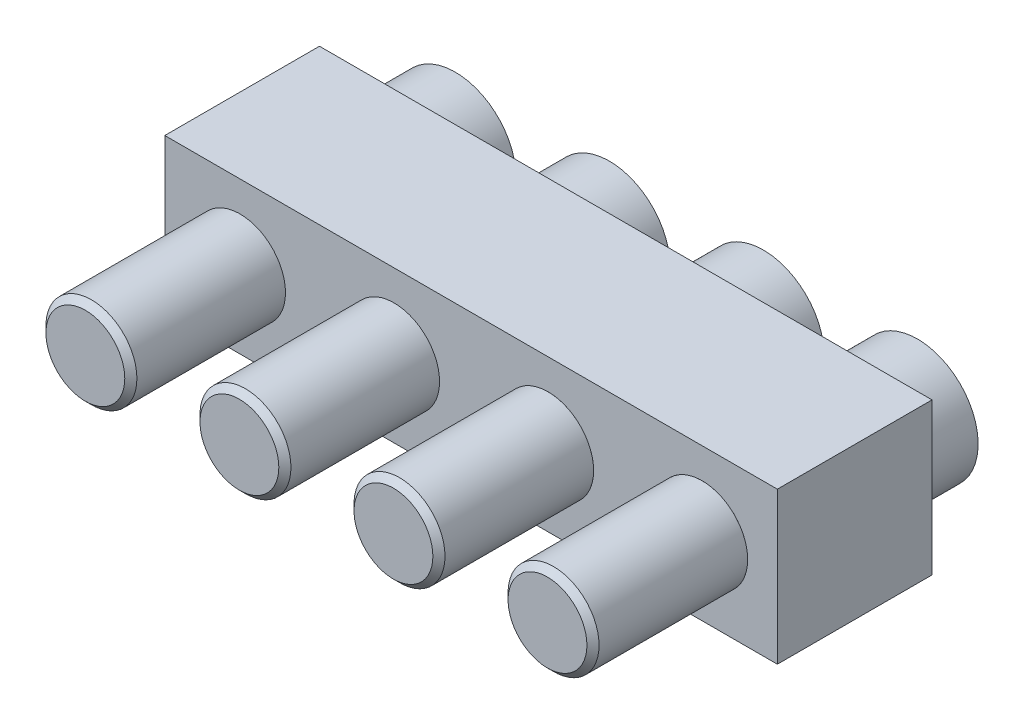
ISO-10303-21;
HEADER;
FILE_DESCRIPTION(('STEP AP214'),'2;1');
FILE_NAME('part.step','',(''),(''),'','','');
FILE_SCHEMA(('AUTOMOTIVE_DESIGN { 1 0 10303 214 1 1 1 1 }'));
ENDSEC;
DATA;
#1=APPLICATION_CONTEXT('core data for automotive mechanical design processes');
#2=APPLICATION_PROTOCOL_DEFINITION('international standard','automotive_design',2000,#1);
#3=PRODUCT_CONTEXT('',#1,'mechanical');
#4=PRODUCT('Part','Part','',(#3));
#5=PRODUCT_RELATED_PRODUCT_CATEGORY('part','',(#4));
#6=PRODUCT_DEFINITION_FORMATION('','',#4);
#7=PRODUCT_DEFINITION_CONTEXT('part definition',#1,'design');
#8=PRODUCT_DEFINITION('design','',#6,#7);
#9=PRODUCT_DEFINITION_SHAPE('','',#8);
#10=(LENGTH_UNIT() NAMED_UNIT(*) SI_UNIT(.MILLI.,.METRE.));
#11=(NAMED_UNIT(*) PLANE_ANGLE_UNIT() SI_UNIT($,.RADIAN.));
#12=(NAMED_UNIT(*) SI_UNIT($,.STERADIAN.) SOLID_ANGLE_UNIT());
#13=UNCERTAINTY_MEASURE_WITH_UNIT(LENGTH_MEASURE(1.E-05),#10,'distance_accuracy_value','');
#14=(GEOMETRIC_REPRESENTATION_CONTEXT(3) GLOBAL_UNCERTAINTY_ASSIGNED_CONTEXT((#13)) GLOBAL_UNIT_ASSIGNED_CONTEXT((#10,
#11,#12)) REPRESENTATION_CONTEXT('',''));
#15=CARTESIAN_POINT('',(0.,0.,0.));
#16=DIRECTION('',(0.,0.,1.));
#17=DIRECTION('',(1.,0.,0.));
#18=AXIS2_PLACEMENT_3D('',#15,#16,#17);
#19=CARTESIAN_POINT('',(8.86,1.24999999999998,5.1));
#20=DIRECTION('',(0.,0.,-1.));
#21=DIRECTION('',(-1.,0.,0.));
#22=AXIS2_PLACEMENT_3D('',#19,#20,#21);
#23=CYLINDRICAL_SURFACE('',#22,0.749999999999998);
#24=CARTESIAN_POINT('',(8.86,1.24999999999998,5.));
#25=DIRECTION('',(0.,0.,1.));
#26=DIRECTION('',(1.,0.,0.));
#27=AXIS2_PLACEMENT_3D('',#24,#25,#26);
#28=CIRCLE('',#27,0.749999999999998);
#29=CARTESIAN_POINT('',(9.61,1.24999999999998,5.));
#30=VERTEX_POINT('',#29);
#31=EDGE_CURVE('E11',#30,#30,#28,.F.);
#32=ORIENTED_EDGE('',*,*,#31,.T.);
#33=EDGE_LOOP('',(#32));
#34=FACE_BOUND('',#33,.T.);
#35=CARTESIAN_POINT('',(8.86,1.24999999999998,2.55));
#36=DIRECTION('',(0.,0.,1.));
#37=DIRECTION('',(1.,0.,0.));
#38=AXIS2_PLACEMENT_3D('',#35,#36,#37);
#39=CIRCLE('',#38,0.749999999999998);
#40=CARTESIAN_POINT('',(9.61,1.24999999999998,2.55));
#41=VERTEX_POINT('',#40);
#42=EDGE_CURVE('E59',#41,#41,#39,.T.);
#43=ORIENTED_EDGE('',*,*,#42,.T.);
#44=EDGE_LOOP('',(#43));
#45=FACE_BOUND('',#44,.T.);
#46=ADVANCED_FACE('F47',(#34,#45),#23,.T.);
#47=CARTESIAN_POINT('',(8.86,1.24999999999998,5.1));
#48=DIRECTION('',(0.,0.,1.));
#49=DIRECTION('',(1.,0.,0.));
#50=AXIS2_PLACEMENT_3D('',#47,#48,#49);
#51=PLANE('',#50);
#52=CARTESIAN_POINT('',(8.86,1.24999999999998,5.1));
#53=DIRECTION('',(0.,0.,1.));
#54=DIRECTION('',(1.,0.,0.));
#55=AXIS2_PLACEMENT_3D('',#52,#53,#54);
#56=CIRCLE('',#55,0.649999999999998);
#57=CARTESIAN_POINT('',(9.51,1.24999999999998,5.1));
#58=VERTEX_POINT('',#57);
#59=EDGE_CURVE('E55',#58,#58,#56,.T.);
#60=ORIENTED_EDGE('',*,*,#59,.T.);
#61=EDGE_LOOP('',(#60));
#62=FACE_BOUND('',#61,.T.);
#63=ADVANCED_FACE('F69',(#62),#51,.T.);
#64=CARTESIAN_POINT('',(8.86,1.24999999999998,2.55));
#65=DIRECTION('',(0.,0.,1.));
#66=DIRECTION('',(1.,0.,0.));
#67=AXIS2_PLACEMENT_3D('',#64,#65,#66);
#68=PLANE('',#67);
#69=ORIENTED_EDGE('',*,*,#42,.F.);
#70=EDGE_LOOP('',(#69));
#71=FACE_BOUND('',#70,.T.);
#72=ADVANCED_FACE('F67',(#71),#68,.F.);
#73=CARTESIAN_POINT('',(8.86,1.24999999999998,5.1));
#74=DIRECTION('',(0.,0.,-1.));
#75=DIRECTION('',(-1.,0.,0.));
#76=AXIS2_PLACEMENT_3D('',#73,#74,#75);
#77=CONICAL_SURFACE('',#76,0.649999999999998,0.78539816339745);
#78=ORIENTED_EDGE('',*,*,#31,.F.);
#79=EDGE_LOOP('',(#78));
#80=FACE_BOUND('',#79,.T.);
#81=ORIENTED_EDGE('',*,*,#59,.F.);
#82=EDGE_LOOP('',(#81));
#83=FACE_BOUND('',#82,.T.);
#84=ADVANCED_FACE('F50',(#80,#83),#77,.T.);
#85=CLOSED_SHELL('',(#46,#63,#72,#84));
#86=MANIFOLD_SOLID_BREP('B2',#85);
#87=CARTESIAN_POINT('',(6.32,1.25,5.1));
#88=DIRECTION('',(0.,0.,-1.));
#89=DIRECTION('',(-1.,0.,0.));
#90=AXIS2_PLACEMENT_3D('',#87,#88,#89);
#91=CYLINDRICAL_SURFACE('',#90,0.75);
#92=CARTESIAN_POINT('',(6.32,1.25,5.));
#93=DIRECTION('',(0.,0.,1.));
#94=DIRECTION('',(1.,0.,0.));
#95=AXIS2_PLACEMENT_3D('',#92,#93,#94);
#96=CIRCLE('',#95,0.75);
#97=CARTESIAN_POINT('',(7.07,1.25,5.));
#98=VERTEX_POINT('',#97);
#99=EDGE_CURVE('E46',#98,#98,#96,.F.);
#100=ORIENTED_EDGE('',*,*,#99,.T.);
#101=EDGE_LOOP('',(#100));
#102=FACE_BOUND('',#101,.T.);
#103=CARTESIAN_POINT('',(6.32,1.25,2.55));
#104=DIRECTION('',(0.,0.,1.));
#105=DIRECTION('',(1.,0.,0.));
#106=AXIS2_PLACEMENT_3D('',#103,#104,#105);
#107=CIRCLE('',#106,0.75);
#108=CARTESIAN_POINT('',(7.07,1.25,2.55));
#109=VERTEX_POINT('',#108);
#110=EDGE_CURVE('E131',#109,#109,#107,.T.);
#111=ORIENTED_EDGE('',*,*,#110,.T.);
#112=EDGE_LOOP('',(#111));
#113=FACE_BOUND('',#112,.T.);
#114=ADVANCED_FACE('F119',(#102,#113),#91,.T.);
#115=CARTESIAN_POINT('',(6.32,1.25,5.1));
#116=DIRECTION('',(0.,0.,1.));
#117=DIRECTION('',(1.,0.,0.));
#118=AXIS2_PLACEMENT_3D('',#115,#116,#117);
#119=PLANE('',#118);
#120=CARTESIAN_POINT('',(6.32,1.25,5.1));
#121=DIRECTION('',(0.,0.,1.));
#122=DIRECTION('',(1.,0.,0.));
#123=AXIS2_PLACEMENT_3D('',#120,#121,#122);
#124=CIRCLE('',#123,0.649999999999999);
#125=CARTESIAN_POINT('',(6.97,1.25,5.1));
#126=VERTEX_POINT('',#125);
#127=EDGE_CURVE('E127',#126,#126,#124,.T.);
#128=ORIENTED_EDGE('',*,*,#127,.T.);
#129=EDGE_LOOP('',(#128));
#130=FACE_BOUND('',#129,.T.);
#131=ADVANCED_FACE('F141',(#130),#119,.T.);
#132=CARTESIAN_POINT('',(6.32,1.25,2.55));
#133=DIRECTION('',(0.,0.,1.));
#134=DIRECTION('',(1.,0.,0.));
#135=AXIS2_PLACEMENT_3D('',#132,#133,#134);
#136=PLANE('',#135);
#137=ORIENTED_EDGE('',*,*,#110,.F.);
#138=EDGE_LOOP('',(#137));
#139=FACE_BOUND('',#138,.T.);
#140=ADVANCED_FACE('F139',(#139),#136,.F.);
#141=CARTESIAN_POINT('',(6.32,1.25,5.1));
#142=DIRECTION('',(0.,0.,-1.));
#143=DIRECTION('',(-1.,0.,0.));
#144=AXIS2_PLACEMENT_3D('',#141,#142,#143);
#145=CONICAL_SURFACE('',#144,0.649999999999999,0.785398163397455);
#146=ORIENTED_EDGE('',*,*,#99,.F.);
#147=EDGE_LOOP('',(#146));
#148=FACE_BOUND('',#147,.T.);
#149=ORIENTED_EDGE('',*,*,#127,.F.);
#150=EDGE_LOOP('',(#149));
#151=FACE_BOUND('',#150,.T.);
#152=ADVANCED_FACE('F122',(#148,#151),#145,.T.);
#153=CLOSED_SHELL('',(#114,#131,#140,#152));
#154=MANIFOLD_SOLID_BREP('B6',#153);
#155=CARTESIAN_POINT('',(1.24,1.24999999999998,5.1));
#156=DIRECTION('',(0.,0.,-1.));
#157=DIRECTION('',(-1.,0.,0.));
#158=AXIS2_PLACEMENT_3D('',#155,#156,#157);
#159=CYLINDRICAL_SURFACE('',#158,0.749999999999999);
#160=CARTESIAN_POINT('',(1.24,1.24999999999998,5.));
#161=DIRECTION('',(0.,0.,1.));
#162=DIRECTION('',(1.,0.,0.));
#163=AXIS2_PLACEMENT_3D('',#160,#161,#162);
#164=CIRCLE('',#163,0.749999999999999);
#165=CARTESIAN_POINT('',(1.99,1.24999999999998,5.));
#166=VERTEX_POINT('',#165);
#167=EDGE_CURVE('E118',#166,#166,#164,.F.);
#168=ORIENTED_EDGE('',*,*,#167,.T.);
#169=EDGE_LOOP('',(#168));
#170=FACE_BOUND('',#169,.T.);
#171=CARTESIAN_POINT('',(1.24,1.24999999999998,2.55));
#172=DIRECTION('',(0.,0.,1.));
#173=DIRECTION('',(1.,0.,0.));
#174=AXIS2_PLACEMENT_3D('',#171,#172,#173);
#175=CIRCLE('',#174,0.749999999999999);
#176=CARTESIAN_POINT('',(1.99,1.24999999999998,2.55));
#177=VERTEX_POINT('',#176);
#178=EDGE_CURVE('E203',#177,#177,#175,.T.);
#179=ORIENTED_EDGE('',*,*,#178,.T.);
#180=EDGE_LOOP('',(#179));
#181=FACE_BOUND('',#180,.T.);
#182=ADVANCED_FACE('F191',(#170,#181),#159,.T.);
#183=CARTESIAN_POINT('',(1.24,1.24999999999998,5.1));
#184=DIRECTION('',(0.,0.,1.));
#185=DIRECTION('',(1.,0.,0.));
#186=AXIS2_PLACEMENT_3D('',#183,#184,#185);
#187=PLANE('',#186);
#188=CARTESIAN_POINT('',(1.24,1.24999999999998,5.1));
#189=DIRECTION('',(0.,0.,1.));
#190=DIRECTION('',(1.,0.,0.));
#191=AXIS2_PLACEMENT_3D('',#188,#189,#190);
#192=CIRCLE('',#191,0.649999999999999);
#193=CARTESIAN_POINT('',(1.89,1.24999999999998,5.1));
#194=VERTEX_POINT('',#193);
#195=EDGE_CURVE('E199',#194,#194,#192,.T.);
#196=ORIENTED_EDGE('',*,*,#195,.T.);
#197=EDGE_LOOP('',(#196));
#198=FACE_BOUND('',#197,.T.);
#199=ADVANCED_FACE('F213',(#198),#187,.T.);
#200=CARTESIAN_POINT('',(1.24,1.24999999999998,2.55));
#201=DIRECTION('',(0.,0.,1.));
#202=DIRECTION('',(1.,0.,0.));
#203=AXIS2_PLACEMENT_3D('',#200,#201,#202);
#204=PLANE('',#203);
#205=ORIENTED_EDGE('',*,*,#178,.F.);
#206=EDGE_LOOP('',(#205));
#207=FACE_BOUND('',#206,.T.);
#208=ADVANCED_FACE('F211',(#207),#204,.F.);
#209=CARTESIAN_POINT('',(1.24,1.24999999999998,5.1));
#210=DIRECTION('',(0.,0.,-1.));
#211=DIRECTION('',(-1.,0.,0.));
#212=AXIS2_PLACEMENT_3D('',#209,#210,#211);
#213=CONICAL_SURFACE('',#212,0.649999999999999,0.785398163397449);
#214=ORIENTED_EDGE('',*,*,#167,.F.);
#215=EDGE_LOOP('',(#214));
#216=FACE_BOUND('',#215,.T.);
#217=ORIENTED_EDGE('',*,*,#195,.F.);
#218=EDGE_LOOP('',(#217));
#219=FACE_BOUND('',#218,.T.);
#220=ADVANCED_FACE('F194',(#216,#219),#213,.T.);
#221=CLOSED_SHELL('',(#182,#199,#208,#220));
#222=MANIFOLD_SOLID_BREP('B41',#221);
#223=CARTESIAN_POINT('',(3.78,1.25,5.1));
#224=DIRECTION('',(0.,0.,-1.));
#225=DIRECTION('',(-1.,0.,0.));
#226=AXIS2_PLACEMENT_3D('',#223,#224,#225);
#227=CYLINDRICAL_SURFACE('',#226,0.749999999999999);
#228=CARTESIAN_POINT('',(3.78,1.25,5.));
#229=DIRECTION('',(0.,0.,1.));
#230=DIRECTION('',(1.,0.,0.));
#231=AXIS2_PLACEMENT_3D('',#228,#229,#230);
#232=CIRCLE('',#231,0.749999999999999);
#233=CARTESIAN_POINT('',(4.53,1.25,5.));
#234=VERTEX_POINT('',#233);
#235=EDGE_CURVE('E190',#234,#234,#232,.F.);
#236=ORIENTED_EDGE('',*,*,#235,.T.);
#237=EDGE_LOOP('',(#236));
#238=FACE_BOUND('',#237,.T.);
#239=CARTESIAN_POINT('',(3.78,1.25,2.55));
#240=DIRECTION('',(0.,0.,1.));
#241=DIRECTION('',(1.,0.,0.));
#242=AXIS2_PLACEMENT_3D('',#239,#240,#241);
#243=CIRCLE('',#242,0.749999999999999);
#244=CARTESIAN_POINT('',(4.53,1.25,2.55));
#245=VERTEX_POINT('',#244);
#246=EDGE_CURVE('E276',#245,#245,#243,.T.);
#247=ORIENTED_EDGE('',*,*,#246,.T.);
#248=EDGE_LOOP('',(#247));
#249=FACE_BOUND('',#248,.T.);
#250=ADVANCED_FACE('F264',(#238,#249),#227,.T.);
#251=CARTESIAN_POINT('',(3.78,1.25,5.1));
#252=DIRECTION('',(0.,0.,1.));
#253=DIRECTION('',(1.,0.,0.));
#254=AXIS2_PLACEMENT_3D('',#251,#252,#253);
#255=PLANE('',#254);
#256=CARTESIAN_POINT('',(3.78,1.25,5.1));
#257=DIRECTION('',(0.,0.,1.));
#258=DIRECTION('',(1.,0.,0.));
#259=AXIS2_PLACEMENT_3D('',#256,#257,#258);
#260=CIRCLE('',#259,0.65);
#261=CARTESIAN_POINT('',(4.43,1.25,5.1));
#262=VERTEX_POINT('',#261);
#263=EDGE_CURVE('E272',#262,#262,#260,.T.);
#264=ORIENTED_EDGE('',*,*,#263,.T.);
#265=EDGE_LOOP('',(#264));
#266=FACE_BOUND('',#265,.T.);
#267=ADVANCED_FACE('F286',(#266),#255,.T.);
#268=CARTESIAN_POINT('',(3.78,1.25,2.55));
#269=DIRECTION('',(0.,0.,1.));
#270=DIRECTION('',(1.,0.,0.));
#271=AXIS2_PLACEMENT_3D('',#268,#269,#270);
#272=PLANE('',#271);
#273=ORIENTED_EDGE('',*,*,#246,.F.);
#274=EDGE_LOOP('',(#273));
#275=FACE_BOUND('',#274,.T.);
#276=ADVANCED_FACE('F284',(#275),#272,.F.);
#277=CARTESIAN_POINT('',(3.78,1.25,5.1));
#278=DIRECTION('',(0.,0.,-1.));
#279=DIRECTION('',(-1.,0.,0.));
#280=AXIS2_PLACEMENT_3D('',#277,#278,#279);
#281=CONICAL_SURFACE('',#280,0.649999999999999,0.785398163397444);
#282=ORIENTED_EDGE('',*,*,#235,.F.);
#283=EDGE_LOOP('',(#282));
#284=FACE_BOUND('',#283,.T.);
#285=ORIENTED_EDGE('',*,*,#263,.F.);
#286=EDGE_LOOP('',(#285));
#287=FACE_BOUND('',#286,.T.);
#288=ADVANCED_FACE('F267',(#284,#287),#281,.T.);
#289=CLOSED_SHELL('',(#250,#267,#276,#288));
#290=MANIFOLD_SOLID_BREP('B113',#289);
#291=CARTESIAN_POINT('',(0.,0.,2.55));
#292=DIRECTION('',(0.,0.,-1.));
#293=DIRECTION('',(-1.,0.,0.));
#294=AXIS2_PLACEMENT_3D('',#291,#292,#293);
#295=PLANE('',#294);
#296=DIRECTION('',(0.,-1.,0.));
#297=VECTOR('',#296,1.);
#298=CARTESIAN_POINT('',(0.,0.,2.55));
#299=LINE('',#298,#297);
#300=CARTESIAN_POINT('',(0.,2.5,2.55));
#301=VERTEX_POINT('',#300);
#302=CARTESIAN_POINT('',(0.,0.,2.55));
#303=VERTEX_POINT('',#302);
#304=EDGE_CURVE('E380',#301,#303,#299,.T.);
#305=ORIENTED_EDGE('',*,*,#304,.T.);
#306=DIRECTION('',(1.,0.,0.));
#307=VECTOR('',#306,1.);
#308=CARTESIAN_POINT('',(0.,0.,2.55));
#309=LINE('',#308,#307);
#310=CARTESIAN_POINT('',(10.1,0.,2.55));
#311=VERTEX_POINT('',#310);
#312=EDGE_CURVE('E375',#303,#311,#309,.T.);
#313=ORIENTED_EDGE('',*,*,#312,.T.);
#314=DIRECTION('',(0.,1.,0.));
#315=VECTOR('',#314,1.);
#316=CARTESIAN_POINT('',(10.1,0.,2.55));
#317=LINE('',#316,#315);
#318=CARTESIAN_POINT('',(10.1,2.5,2.55));
#319=VERTEX_POINT('',#318);
#320=EDGE_CURVE('E378',#311,#319,#317,.T.);
#321=ORIENTED_EDGE('',*,*,#320,.T.);
#322=DIRECTION('',(-1.,0.,0.));
#323=VECTOR('',#322,1.);
#324=CARTESIAN_POINT('',(0.,2.5,2.55));
#325=LINE('',#324,#323);
#326=EDGE_CURVE('E345',#319,#301,#325,.T.);
#327=ORIENTED_EDGE('',*,*,#326,.T.);
#328=EDGE_LOOP('',(#305,#313,#321,#327));
#329=FACE_BOUND('',#328,.T.);
#330=CARTESIAN_POINT('',(3.78,1.25,2.55));
#331=DIRECTION('',(0.,0.,1.));
#332=DIRECTION('',(1.,0.,0.));
#333=AXIS2_PLACEMENT_3D('',#330,#331,#332);
#334=CIRCLE('',#333,0.749999999999999);
#335=CARTESIAN_POINT('',(4.53,1.25,2.55));
#336=VERTEX_POINT('',#335);
#337=EDGE_CURVE('E395',#336,#336,#334,.T.);
#338=ORIENTED_EDGE('',*,*,#337,.F.);
#339=EDGE_LOOP('',(#338));
#340=FACE_BOUND('',#339,.T.);
#341=CARTESIAN_POINT('',(8.86,1.24999999999998,2.55));
#342=DIRECTION('',(0.,0.,1.));
#343=DIRECTION('',(-1.,0.,0.));
#344=AXIS2_PLACEMENT_3D('',#341,#342,#343);
#345=CIRCLE('',#344,0.749999999999998);
#346=CARTESIAN_POINT('',(8.11,1.24999999999998,2.55));
#347=VERTEX_POINT('',#346);
#348=EDGE_CURVE('E409',#347,#347,#345,.T.);
#349=ORIENTED_EDGE('',*,*,#348,.F.);
#350=EDGE_LOOP('',(#349));
#351=FACE_BOUND('',#350,.T.);
#352=CARTESIAN_POINT('',(1.24,1.24999999999998,2.55));
#353=DIRECTION('',(0.,0.,1.));
#354=DIRECTION('',(1.,0.,0.));
#355=AXIS2_PLACEMENT_3D('',#352,#353,#354);
#356=CIRCLE('',#355,0.749999999999999);
#357=CARTESIAN_POINT('',(1.99,1.24999999999998,2.55));
#358=VERTEX_POINT('',#357);
#359=EDGE_CURVE('E415',#358,#358,#356,.T.);
#360=ORIENTED_EDGE('',*,*,#359,.F.);
#361=EDGE_LOOP('',(#360));
#362=FACE_BOUND('',#361,.T.);
#363=CARTESIAN_POINT('',(6.32,1.25,2.55));
#364=DIRECTION('',(0.,0.,1.));
#365=DIRECTION('',(-1.,0.,0.));
#366=AXIS2_PLACEMENT_3D('',#363,#364,#365);
#367=CIRCLE('',#366,0.749999999999999);
#368=CARTESIAN_POINT('',(5.57,1.25,2.55));
#369=VERTEX_POINT('',#368);
#370=EDGE_CURVE('E421',#369,#369,#367,.T.);
#371=ORIENTED_EDGE('',*,*,#370,.F.);
#372=EDGE_LOOP('',(#371));
#373=FACE_BOUND('',#372,.T.);
#374=ADVANCED_FACE('F328',(#329,#340,#351,#362,#373),#295,.F.);
#375=CARTESIAN_POINT('',(0.,0.,0.));
#376=DIRECTION('',(0.,0.,-1.));
#377=DIRECTION('',(-1.,0.,0.));
#378=AXIS2_PLACEMENT_3D('',#375,#376,#377);
#379=PLANE('',#378);
#380=CARTESIAN_POINT('',(1.24,1.24999999999998,0.));
#381=DIRECTION('',(0.,0.,-1.));
#382=DIRECTION('',(1.,0.,0.));
#383=AXIS2_PLACEMENT_3D('',#380,#381,#382);
#384=CIRCLE('',#383,1.);
#385=CARTESIAN_POINT('',(2.24,1.24999999999998,0.));
#386=VERTEX_POINT('',#385);
#387=EDGE_CURVE('E448',#386,#386,#384,.T.);
#388=ORIENTED_EDGE('',*,*,#387,.F.);
#389=EDGE_LOOP('',(#388));
#390=FACE_BOUND('',#389,.T.);
#391=CARTESIAN_POINT('',(3.78,1.25,0.));
#392=DIRECTION('',(0.,0.,-1.));
#393=DIRECTION('',(1.,0.,0.));
#394=AXIS2_PLACEMENT_3D('',#391,#392,#393);
#395=CIRCLE('',#394,1.);
#396=CARTESIAN_POINT('',(4.78,1.25,0.));
#397=VERTEX_POINT('',#396);
#398=EDGE_CURVE('E442',#397,#397,#395,.T.);
#399=ORIENTED_EDGE('',*,*,#398,.F.);
#400=EDGE_LOOP('',(#399));
#401=FACE_BOUND('',#400,.T.);
#402=CARTESIAN_POINT('',(8.86,1.24999999999998,0.));
#403=DIRECTION('',(0.,0.,-1.));
#404=DIRECTION('',(-1.,0.,0.));
#405=AXIS2_PLACEMENT_3D('',#402,#403,#404);
#406=CIRCLE('',#405,1.);
#407=CARTESIAN_POINT('',(7.86,1.24999999999998,0.));
#408=VERTEX_POINT('',#407);
#409=EDGE_CURVE('E436',#408,#408,#406,.T.);
#410=ORIENTED_EDGE('',*,*,#409,.F.);
#411=EDGE_LOOP('',(#410));
#412=FACE_BOUND('',#411,.T.);
#413=CARTESIAN_POINT('',(6.32,1.25,0.));
#414=DIRECTION('',(0.,0.,-1.));
#415=DIRECTION('',(-1.,0.,0.));
#416=AXIS2_PLACEMENT_3D('',#413,#414,#415);
#417=CIRCLE('',#416,1.);
#418=CARTESIAN_POINT('',(5.32,1.25,0.));
#419=VERTEX_POINT('',#418);
#420=EDGE_CURVE('E430',#419,#419,#417,.T.);
#421=ORIENTED_EDGE('',*,*,#420,.F.);
#422=EDGE_LOOP('',(#421));
#423=FACE_BOUND('',#422,.T.);
#424=DIRECTION('',(0.,-1.,0.));
#425=VECTOR('',#424,1.);
#426=CARTESIAN_POINT('',(0.,0.,0.));
#427=LINE('',#426,#425);
#428=CARTESIAN_POINT('',(0.,2.5,0.));
#429=VERTEX_POINT('',#428);
#430=CARTESIAN_POINT('',(0.,0.,0.));
#431=VERTEX_POINT('',#430);
#432=EDGE_CURVE('E392',#429,#431,#427,.T.);
#433=ORIENTED_EDGE('',*,*,#432,.F.);
#434=DIRECTION('',(-1.,0.,0.));
#435=VECTOR('',#434,1.);
#436=CARTESIAN_POINT('',(0.,2.5,0.));
#437=LINE('',#436,#435);
#438=CARTESIAN_POINT('',(10.1,2.5,0.));
#439=VERTEX_POINT('',#438);
#440=EDGE_CURVE('E368',#439,#429,#437,.T.);
#441=ORIENTED_EDGE('',*,*,#440,.F.);
#442=DIRECTION('',(0.,1.,0.));
#443=VECTOR('',#442,1.);
#444=CARTESIAN_POINT('',(10.1,0.,0.));
#445=LINE('',#444,#443);
#446=CARTESIAN_POINT('',(10.1,0.,0.));
#447=VERTEX_POINT('',#446);
#448=EDGE_CURVE('E362',#447,#439,#445,.T.);
#449=ORIENTED_EDGE('',*,*,#448,.F.);
#450=DIRECTION('',(1.,0.,0.));
#451=VECTOR('',#450,1.);
#452=CARTESIAN_POINT('',(0.,0.,0.));
#453=LINE('',#452,#451);
#454=EDGE_CURVE('E384',#431,#447,#453,.T.);
#455=ORIENTED_EDGE('',*,*,#454,.F.);
#456=EDGE_LOOP('',(#433,#441,#449,#455));
#457=FACE_BOUND('',#456,.T.);
#458=ADVANCED_FACE('F403',(#390,#401,#412,#423,#457),#379,.T.);
#459=CARTESIAN_POINT('',(0.,0.,2.55));
#460=DIRECTION('',(1.,0.,0.));
#461=DIRECTION('',(0.,0.,-1.));
#462=AXIS2_PLACEMENT_3D('',#459,#460,#461);
#463=PLANE('',#462);
#464=ORIENTED_EDGE('',*,*,#432,.T.);
#465=DIRECTION('',(0.,0.,-1.));
#466=VECTOR('',#465,1.);
#467=CARTESIAN_POINT('',(0.,0.,2.55));
#468=LINE('',#467,#466);
#469=EDGE_CURVE('E262',#303,#431,#468,.T.);
#470=ORIENTED_EDGE('',*,*,#469,.F.);
#471=ORIENTED_EDGE('',*,*,#304,.F.);
#472=DIRECTION('',(0.,0.,-1.));
#473=VECTOR('',#472,1.);
#474=CARTESIAN_POINT('',(0.,2.5,2.55));
#475=LINE('',#474,#473);
#476=EDGE_CURVE('E388',#301,#429,#475,.T.);
#477=ORIENTED_EDGE('',*,*,#476,.T.);
#478=EDGE_LOOP('',(#464,#470,#471,#477));
#479=FACE_BOUND('',#478,.T.);
#480=ADVANCED_FACE('F330',(#479),#463,.F.);
#481=CARTESIAN_POINT('',(0.,0.,2.55));
#482=DIRECTION('',(0.,1.,0.));
#483=DIRECTION('',(0.,0.,1.));
#484=AXIS2_PLACEMENT_3D('',#481,#482,#483);
#485=PLANE('',#484);
#486=ORIENTED_EDGE('',*,*,#454,.T.);
#487=DIRECTION('',(0.,0.,-1.));
#488=VECTOR('',#487,1.);
#489=CARTESIAN_POINT('',(10.1,0.,2.55));
#490=LINE('',#489,#488);
#491=EDGE_CURVE('E337',#311,#447,#490,.T.);
#492=ORIENTED_EDGE('',*,*,#491,.F.);
#493=ORIENTED_EDGE('',*,*,#312,.F.);
#494=ORIENTED_EDGE('',*,*,#469,.T.);
#495=EDGE_LOOP('',(#486,#492,#493,#494));
#496=FACE_BOUND('',#495,.T.);
#497=ADVANCED_FACE('F383',(#496),#485,.F.);
#498=CARTESIAN_POINT('',(10.1,0.,2.55));
#499=DIRECTION('',(-1.,0.,0.));
#500=DIRECTION('',(0.,0.,1.));
#501=AXIS2_PLACEMENT_3D('',#498,#499,#500);
#502=PLANE('',#501);
#503=ORIENTED_EDGE('',*,*,#448,.T.);
#504=DIRECTION('',(0.,0.,-1.));
#505=VECTOR('',#504,1.);
#506=CARTESIAN_POINT('',(10.1,2.5,2.55));
#507=LINE('',#506,#505);
#508=EDGE_CURVE('E385',#319,#439,#507,.T.);
#509=ORIENTED_EDGE('',*,*,#508,.F.);
#510=ORIENTED_EDGE('',*,*,#320,.F.);
#511=ORIENTED_EDGE('',*,*,#491,.T.);
#512=EDGE_LOOP('',(#503,#509,#510,#511));
#513=FACE_BOUND('',#512,.T.);
#514=ADVANCED_FACE('F386',(#513),#502,.F.);
#515=CARTESIAN_POINT('',(0.,2.5,2.55));
#516=DIRECTION('',(0.,-1.,0.));
#517=DIRECTION('',(0.,0.,-1.));
#518=AXIS2_PLACEMENT_3D('',#515,#516,#517);
#519=PLANE('',#518);
#520=ORIENTED_EDGE('',*,*,#440,.T.);
#521=ORIENTED_EDGE('',*,*,#476,.F.);
#522=ORIENTED_EDGE('',*,*,#326,.F.);
#523=ORIENTED_EDGE('',*,*,#508,.T.);
#524=EDGE_LOOP('',(#520,#521,#522,#523));
#525=FACE_BOUND('',#524,.T.);
#526=ADVANCED_FACE('F400',(#525),#519,.F.);
#527=CARTESIAN_POINT('',(3.78,1.25,2.55));
#528=DIRECTION('',(0.,0.,-1.));
#529=DIRECTION('',(-1.,0.,0.));
#530=AXIS2_PLACEMENT_3D('',#527,#528,#529);
#531=CYLINDRICAL_SURFACE('',#530,0.749999999999999);
#532=ORIENTED_EDGE('',*,*,#337,.T.);
#533=EDGE_LOOP('',(#532));
#534=FACE_BOUND('',#533,.T.);
#535=CARTESIAN_POINT('',(3.78,1.25,0.));
#536=DIRECTION('',(0.,0.,1.));
#537=DIRECTION('',(1.,0.,0.));
#538=AXIS2_PLACEMENT_3D('',#535,#536,#537);
#539=CIRCLE('',#538,0.749999999999999);
#540=CARTESIAN_POINT('',(4.53,1.25,0.));
#541=VERTEX_POINT('',#540);
#542=EDGE_CURVE('E406',#541,#541,#539,.T.);
#543=ORIENTED_EDGE('',*,*,#542,.F.);
#544=EDGE_LOOP('',(#543));
#545=FACE_BOUND('',#544,.T.);
#546=ADVANCED_FACE('F495',(#534,#545),#531,.F.);
#547=CARTESIAN_POINT('',(8.86,1.24999999999998,2.55));
#548=DIRECTION('',(0.,0.,-1.));
#549=DIRECTION('',(-1.,0.,0.));
#550=AXIS2_PLACEMENT_3D('',#547,#548,#549);
#551=CYLINDRICAL_SURFACE('',#550,0.749999999999998);
#552=ORIENTED_EDGE('',*,*,#348,.T.);
#553=EDGE_LOOP('',(#552));
#554=FACE_BOUND('',#553,.T.);
#555=CARTESIAN_POINT('',(8.86,1.24999999999998,0.));
#556=DIRECTION('',(0.,0.,1.));
#557=DIRECTION('',(-1.,0.,0.));
#558=AXIS2_PLACEMENT_3D('',#555,#556,#557);
#559=CIRCLE('',#558,0.749999999999998);
#560=CARTESIAN_POINT('',(8.11,1.24999999999998,0.));
#561=VERTEX_POINT('',#560);
#562=EDGE_CURVE('E412',#561,#561,#559,.T.);
#563=ORIENTED_EDGE('',*,*,#562,.F.);
#564=EDGE_LOOP('',(#563));
#565=FACE_BOUND('',#564,.T.);
#566=ADVANCED_FACE('F637',(#554,#565),#551,.F.);
#567=CARTESIAN_POINT('',(1.24,1.24999999999998,2.55));
#568=DIRECTION('',(0.,0.,-1.));
#569=DIRECTION('',(-1.,0.,0.));
#570=AXIS2_PLACEMENT_3D('',#567,#568,#569);
#571=CYLINDRICAL_SURFACE('',#570,0.749999999999999);
#572=ORIENTED_EDGE('',*,*,#359,.T.);
#573=EDGE_LOOP('',(#572));
#574=FACE_BOUND('',#573,.T.);
#575=CARTESIAN_POINT('',(1.24,1.24999999999998,0.));
#576=DIRECTION('',(0.,0.,1.));
#577=DIRECTION('',(1.,0.,0.));
#578=AXIS2_PLACEMENT_3D('',#575,#576,#577);
#579=CIRCLE('',#578,0.749999999999999);
#580=CARTESIAN_POINT('',(1.99,1.24999999999998,0.));
#581=VERTEX_POINT('',#580);
#582=EDGE_CURVE('E418',#581,#581,#579,.T.);
#583=ORIENTED_EDGE('',*,*,#582,.F.);
#584=EDGE_LOOP('',(#583));
#585=FACE_BOUND('',#584,.T.);
#586=ADVANCED_FACE('F635',(#574,#585),#571,.F.);
#587=CARTESIAN_POINT('',(6.32,1.25,2.55));
#588=DIRECTION('',(0.,0.,-1.));
#589=DIRECTION('',(-1.,0.,0.));
#590=AXIS2_PLACEMENT_3D('',#587,#588,#589);
#591=CYLINDRICAL_SURFACE('',#590,0.749999999999999);
#592=ORIENTED_EDGE('',*,*,#370,.T.);
#593=EDGE_LOOP('',(#592));
#594=FACE_BOUND('',#593,.T.);
#595=CARTESIAN_POINT('',(6.32,1.25,0.));
#596=DIRECTION('',(0.,0.,1.));
#597=DIRECTION('',(-1.,0.,0.));
#598=AXIS2_PLACEMENT_3D('',#595,#596,#597);
#599=CIRCLE('',#598,0.749999999999999);
#600=CARTESIAN_POINT('',(5.57,1.25,0.));
#601=VERTEX_POINT('',#600);
#602=EDGE_CURVE('E424',#601,#601,#599,.T.);
#603=ORIENTED_EDGE('',*,*,#602,.F.);
#604=EDGE_LOOP('',(#603));
#605=FACE_BOUND('',#604,.T.);
#606=ADVANCED_FACE('F485',(#594,#605),#591,.F.);
#607=CARTESIAN_POINT('',(6.32,1.25,0.));
#608=DIRECTION('',(0.,0.,-1.));
#609=DIRECTION('',(-1.,0.,0.));
#610=AXIS2_PLACEMENT_3D('',#607,#608,#609);
#611=PLANE('',#610);
#612=ORIENTED_EDGE('',*,*,#602,.T.);
#613=EDGE_LOOP('',(#612));
#614=FACE_BOUND('',#613,.T.);
#615=ADVANCED_FACE('F475',(#614),#611,.F.);
#616=CARTESIAN_POINT('',(6.32,1.25,-1.));
#617=DIRECTION('',(0.,0.,1.));
#618=DIRECTION('',(1.,0.,0.));
#619=AXIS2_PLACEMENT_3D('',#616,#617,#618);
#620=CYLINDRICAL_SURFACE('',#619,1.);
#621=CARTESIAN_POINT('',(6.32,1.25,-1.));
#622=DIRECTION('',(0.,0.,-1.));
#623=DIRECTION('',(-1.,0.,0.));
#624=AXIS2_PLACEMENT_3D('',#621,#622,#623);
#625=CIRCLE('',#624,1.);
#626=CARTESIAN_POINT('',(5.32,1.25,-1.));
#627=VERTEX_POINT('',#626);
#628=EDGE_CURVE('E427',#627,#627,#625,.T.);
#629=ORIENTED_EDGE('',*,*,#628,.F.);
#630=EDGE_LOOP('',(#629));
#631=FACE_BOUND('',#630,.T.);
#632=ORIENTED_EDGE('',*,*,#420,.T.);
#633=EDGE_LOOP('',(#632));
#634=FACE_BOUND('',#633,.T.);
#635=ADVANCED_FACE('F472',(#631,#634),#620,.T.);
#636=CARTESIAN_POINT('',(6.32,1.25,-1.));
#637=DIRECTION('',(0.,0.,-1.));
#638=DIRECTION('',(-1.,0.,0.));
#639=AXIS2_PLACEMENT_3D('',#636,#637,#638);
#640=PLANE('',#639);
#641=ORIENTED_EDGE('',*,*,#628,.T.);
#642=EDGE_LOOP('',(#641));
#643=FACE_BOUND('',#642,.T.);
#644=ADVANCED_FACE('F474',(#643),#640,.T.);
#645=CARTESIAN_POINT('',(8.86,1.24999999999998,0.));
#646=DIRECTION('',(0.,0.,-1.));
#647=DIRECTION('',(-1.,0.,0.));
#648=AXIS2_PLACEMENT_3D('',#645,#646,#647);
#649=PLANE('',#648);
#650=ORIENTED_EDGE('',*,*,#562,.T.);
#651=EDGE_LOOP('',(#650));
#652=FACE_BOUND('',#651,.T.);
#653=ADVANCED_FACE('F482',(#652),#649,.F.);
#654=CARTESIAN_POINT('',(8.86,1.24999999999998,-1.));
#655=DIRECTION('',(0.,0.,1.));
#656=DIRECTION('',(1.,0.,0.));
#657=AXIS2_PLACEMENT_3D('',#654,#655,#656);
#658=CYLINDRICAL_SURFACE('',#657,1.);
#659=CARTESIAN_POINT('',(8.86,1.24999999999998,-1.));
#660=DIRECTION('',(0.,0.,-1.));
#661=DIRECTION('',(-1.,0.,0.));
#662=AXIS2_PLACEMENT_3D('',#659,#660,#661);
#663=CIRCLE('',#662,1.);
#664=CARTESIAN_POINT('',(7.86,1.24999999999998,-1.));
#665=VERTEX_POINT('',#664);
#666=EDGE_CURVE('E433',#665,#665,#663,.T.);
#667=ORIENTED_EDGE('',*,*,#666,.F.);
#668=EDGE_LOOP('',(#667));
#669=FACE_BOUND('',#668,.T.);
#670=ORIENTED_EDGE('',*,*,#409,.T.);
#671=EDGE_LOOP('',(#670));
#672=FACE_BOUND('',#671,.T.);
#673=ADVANCED_FACE('F550',(#669,#672),#658,.T.);
#674=CARTESIAN_POINT('',(8.86,1.24999999999998,-1.));
#675=DIRECTION('',(0.,0.,-1.));
#676=DIRECTION('',(-1.,0.,0.));
#677=AXIS2_PLACEMENT_3D('',#674,#675,#676);
#678=PLANE('',#677);
#679=ORIENTED_EDGE('',*,*,#666,.T.);
#680=EDGE_LOOP('',(#679));
#681=FACE_BOUND('',#680,.T.);
#682=ADVANCED_FACE('F560',(#681),#678,.T.);
#683=CARTESIAN_POINT('',(3.78,1.25,0.));
#684=DIRECTION('',(0.,0.,1.));
#685=DIRECTION('',(1.,0.,0.));
#686=AXIS2_PLACEMENT_3D('',#683,#684,#685);
#687=PLANE('',#686);
#688=ORIENTED_EDGE('',*,*,#542,.T.);
#689=EDGE_LOOP('',(#688));
#690=FACE_BOUND('',#689,.T.);
#691=ADVANCED_FACE('F570',(#690),#687,.T.);
#692=CARTESIAN_POINT('',(3.78,1.25,-1.));
#693=DIRECTION('',(0.,0.,1.));
#694=DIRECTION('',(1.,0.,0.));
#695=AXIS2_PLACEMENT_3D('',#692,#693,#694);
#696=CYLINDRICAL_SURFACE('',#695,1.);
#697=CARTESIAN_POINT('',(3.78,1.25,-1.));
#698=DIRECTION('',(0.,0.,-1.));
#699=DIRECTION('',(1.,0.,0.));
#700=AXIS2_PLACEMENT_3D('',#697,#698,#699);
#701=CIRCLE('',#700,1.);
#702=CARTESIAN_POINT('',(4.78,1.25,-1.));
#703=VERTEX_POINT('',#702);
#704=EDGE_CURVE('E439',#703,#703,#701,.T.);
#705=ORIENTED_EDGE('',*,*,#704,.F.);
#706=EDGE_LOOP('',(#705));
#707=FACE_BOUND('',#706,.T.);
#708=ORIENTED_EDGE('',*,*,#398,.T.);
#709=EDGE_LOOP('',(#708));
#710=FACE_BOUND('',#709,.T.);
#711=ADVANCED_FACE('F580',(#707,#710),#696,.T.);
#712=CARTESIAN_POINT('',(3.78,1.25,-1.));
#713=DIRECTION('',(0.,0.,1.));
#714=DIRECTION('',(1.,0.,0.));
#715=AXIS2_PLACEMENT_3D('',#712,#713,#714);
#716=PLANE('',#715);
#717=ORIENTED_EDGE('',*,*,#704,.T.);
#718=EDGE_LOOP('',(#717));
#719=FACE_BOUND('',#718,.T.);
#720=ADVANCED_FACE('F590',(#719),#716,.F.);
#721=CARTESIAN_POINT('',(1.24,1.24999999999998,0.));
#722=DIRECTION('',(0.,0.,1.));
#723=DIRECTION('',(1.,0.,0.));
#724=AXIS2_PLACEMENT_3D('',#721,#722,#723);
#725=PLANE('',#724);
#726=ORIENTED_EDGE('',*,*,#582,.T.);
#727=EDGE_LOOP('',(#726));
#728=FACE_BOUND('',#727,.T.);
#729=ADVANCED_FACE('F459',(#728),#725,.T.);
#730=CARTESIAN_POINT('',(1.24,1.24999999999998,-1.));
#731=DIRECTION('',(0.,0.,1.));
#732=DIRECTION('',(1.,0.,0.));
#733=AXIS2_PLACEMENT_3D('',#730,#731,#732);
#734=CYLINDRICAL_SURFACE('',#733,1.);
#735=CARTESIAN_POINT('',(1.24,1.24999999999998,-1.));
#736=DIRECTION('',(0.,0.,-1.));
#737=DIRECTION('',(1.,0.,0.));
#738=AXIS2_PLACEMENT_3D('',#735,#736,#737);
#739=CIRCLE('',#738,1.);
#740=CARTESIAN_POINT('',(2.24,1.24999999999998,-1.));
#741=VERTEX_POINT('',#740);
#742=EDGE_CURVE('E445',#741,#741,#739,.T.);
#743=ORIENTED_EDGE('',*,*,#742,.F.);
#744=EDGE_LOOP('',(#743));
#745=FACE_BOUND('',#744,.T.);
#746=ORIENTED_EDGE('',*,*,#387,.T.);
#747=EDGE_LOOP('',(#746));
#748=FACE_BOUND('',#747,.T.);
#749=ADVANCED_FACE('F456',(#745,#748),#734,.T.);
#750=CARTESIAN_POINT('',(1.24,1.24999999999998,-1.));
#751=DIRECTION('',(0.,0.,1.));
#752=DIRECTION('',(1.,0.,0.));
#753=AXIS2_PLACEMENT_3D('',#750,#751,#752);
#754=PLANE('',#753);
#755=ORIENTED_EDGE('',*,*,#742,.T.);
#756=EDGE_LOOP('',(#755));
#757=FACE_BOUND('',#756,.T.);
#758=ADVANCED_FACE('F454',(#757),#754,.F.);
#759=CLOSED_SHELL('',(#374,#458,#480,#497,#514,#526,#546,#566,#586,#606,#615,#635,#644,#653,
#673,#682,#691,#711,#720,#729,#749,#758));
#760=MANIFOLD_SOLID_BREP('B185',#759);
#761=ADVANCED_BREP_SHAPE_REPRESENTATION('',(#18,#86,#154,#222,#290,#760),#14);
#762=SHAPE_DEFINITION_REPRESENTATION(#9,#761);
ENDSEC;
END-ISO-10303-21;
